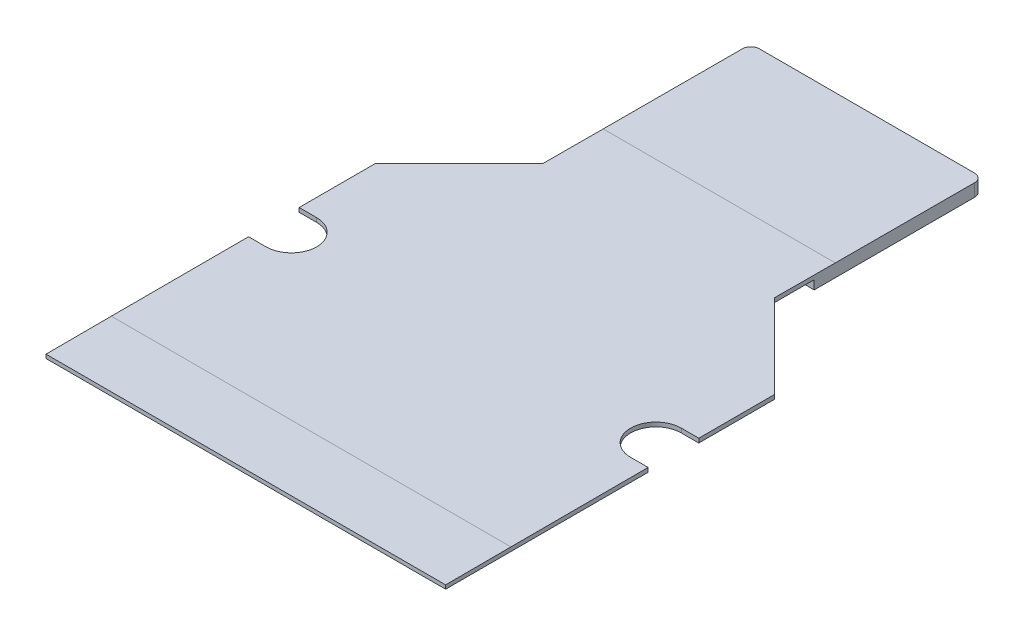
ISO-10303-21;
HEADER;
FILE_DESCRIPTION(('STEP AP214'),'2;1');
FILE_NAME('part.step','',(''),(''),'','','');
FILE_SCHEMA(('AUTOMOTIVE_DESIGN { 1 0 10303 214 1 1 1 1 }'));
ENDSEC;
DATA;
#1=APPLICATION_CONTEXT('core data for automotive mechanical design processes');
#2=APPLICATION_PROTOCOL_DEFINITION('international standard','automotive_design',2000,#1);
#3=PRODUCT_CONTEXT('',#1,'mechanical');
#4=PRODUCT('Part','Part','',(#3));
#5=PRODUCT_RELATED_PRODUCT_CATEGORY('part','',(#4));
#6=PRODUCT_DEFINITION_FORMATION('','',#4);
#7=PRODUCT_DEFINITION_CONTEXT('part definition',#1,'design');
#8=PRODUCT_DEFINITION('design','',#6,#7);
#9=PRODUCT_DEFINITION_SHAPE('','',#8);
#10=(LENGTH_UNIT() NAMED_UNIT(*) SI_UNIT(.MILLI.,.METRE.));
#11=(NAMED_UNIT(*) PLANE_ANGLE_UNIT() SI_UNIT($,.RADIAN.));
#12=(NAMED_UNIT(*) SI_UNIT($,.STERADIAN.) SOLID_ANGLE_UNIT());
#13=UNCERTAINTY_MEASURE_WITH_UNIT(LENGTH_MEASURE(1.E-05),#10,'distance_accuracy_value','');
#14=(GEOMETRIC_REPRESENTATION_CONTEXT(3) GLOBAL_UNCERTAINTY_ASSIGNED_CONTEXT((#13)) GLOBAL_UNIT_ASSIGNED_CONTEXT((#10,
#11,#12)) REPRESENTATION_CONTEXT('',''));
#15=CARTESIAN_POINT('',(0.,0.,0.));
#16=DIRECTION('',(0.,0.,1.));
#17=DIRECTION('',(1.,0.,0.));
#18=AXIS2_PLACEMENT_3D('',#15,#16,#17);
#19=CARTESIAN_POINT('',(-3.3,0.09,-5.47));
#20=DIRECTION('',(0.,-1.,0.));
#21=DIRECTION('',(0.,0.,-1.));
#22=AXIS2_PLACEMENT_3D('',#19,#20,#21);
#23=PLANE('',#22);
#24=DIRECTION('',(-1.,0.,0.));
#25=VECTOR('',#24,1.);
#26=CARTESIAN_POINT('',(3.06,0.09,-9.32));
#27=LINE('',#26,#25);
#28=CARTESIAN_POINT('',(-2.55,0.0900000000000086,-9.32));
#29=VERTEX_POINT('',#28);
#30=CARTESIAN_POINT('',(2.55,0.0900000000000172,-9.32));
#31=VERTEX_POINT('',#30);
#32=EDGE_CURVE('E183',#29,#31,#27,.F.);
#33=ORIENTED_EDGE('',*,*,#32,.F.);
#34=CARTESIAN_POINT('',(-2.55,0.0900000000000345,-9.12));
#35=DIRECTION('',(0.,-1.,0.));
#36=DIRECTION('',(-1.,0.,0.));
#37=AXIS2_PLACEMENT_3D('',#34,#35,#36);
#38=CIRCLE('',#37,0.2);
#39=CARTESIAN_POINT('',(-2.75,0.0900000000000138,-9.12));
#40=VERTEX_POINT('',#39);
#41=EDGE_CURVE('E179',#40,#29,#38,.T.);
#42=ORIENTED_EDGE('',*,*,#41,.F.);
#43=CARTESIAN_POINT('',(-2.75,0.1,-5.82));
#44=DIRECTION('',(0.,-0.00303028911716179,-0.999995408663393));
#45=VECTOR('',#44,1.);
#46=LINE('',#43,#45);
#47=CARTESIAN_POINT('',(-2.75,0.095,-5.82));
#48=VERTEX_POINT('',#47);
#49=EDGE_CURVE('E297',#48,#40,#46,.T.);
#50=ORIENTED_EDGE('',*,*,#49,.F.);
#51=CARTESIAN_POINT('',(2.75,0.1,-5.82));
#52=DIRECTION('',(-1.,0.,0.));
#53=VECTOR('',#52,1.);
#54=LINE('',#51,#53);
#55=CARTESIAN_POINT('',(2.75,0.095000000000016,-5.81999999999474));
#56=VERTEX_POINT('',#55);
#57=EDGE_CURVE('E266',#56,#48,#54,.T.);
#58=ORIENTED_EDGE('',*,*,#57,.F.);
#59=CARTESIAN_POINT('',(2.75,0.09,-9.12));
#60=DIRECTION('',(0.,0.00303028911716179,0.999995408663393));
#61=VECTOR('',#60,1.);
#62=LINE('',#59,#61);
#63=CARTESIAN_POINT('',(2.75,0.0900000000000069,-9.12));
#64=VERTEX_POINT('',#63);
#65=EDGE_CURVE('E272',#64,#56,#62,.T.);
#66=ORIENTED_EDGE('',*,*,#65,.F.);
#67=CARTESIAN_POINT('',(2.55,0.0900000000000345,-9.12));
#68=DIRECTION('',(0.,-1.,0.));
#69=DIRECTION('',(0.,0.,-1.));
#70=AXIS2_PLACEMENT_3D('',#67,#68,#69);
#71=CIRCLE('',#70,0.200000000000001);
#72=EDGE_CURVE('E286',#31,#64,#71,.T.);
#73=ORIENTED_EDGE('',*,*,#72,.F.);
#74=EDGE_LOOP('',(#33,#42,#50,#58,#66,#73));
#75=FACE_BOUND('',#74,.T.);
#76=ADVANCED_FACE('F17',(#75),#23,.F.);
#77=CARTESIAN_POINT('',(-2.75,-0.241,-9.5935));
#78=DIRECTION('',(-1.,0.,0.));
#79=DIRECTION('',(0.,0.,1.));
#80=AXIS2_PLACEMENT_3D('',#77,#78,#79);
#81=PLANE('',#80);
#82=DIRECTION('',(0.,1.,0.));
#83=VECTOR('',#82,1.);
#84=CARTESIAN_POINT('',(-2.75,-0.241,-4.385));
#85=LINE('',#84,#83);
#86=CARTESIAN_POINT('',(-2.75,0.,-4.385));
#87=VERTEX_POINT('',#86);
#88=CARTESIAN_POINT('',(-2.75,0.1,-4.385));
#89=VERTEX_POINT('',#88);
#90=EDGE_CURVE('E553',#87,#89,#85,.T.);
#91=ORIENTED_EDGE('',*,*,#90,.T.);
#92=DIRECTION('',(0.,0.,1.));
#93=VECTOR('',#92,1.);
#94=CARTESIAN_POINT('',(-2.75,0.1,-6.7872));
#95=LINE('',#94,#93);
#96=EDGE_CURVE('E263',#48,#89,#95,.T.);
#97=ORIENTED_EDGE('',*,*,#96,.F.);
#98=ORIENTED_EDGE('',*,*,#49,.T.);
#99=DIRECTION('',(0.,-1.,0.));
#100=VECTOR('',#99,1.);
#101=CARTESIAN_POINT('',(-2.75,-999.9,-9.12));
#102=LINE('',#101,#100);
#103=CARTESIAN_POINT('',(-2.75,-0.210000000000033,-9.12));
#104=VERTEX_POINT('',#103);
#105=EDGE_CURVE('E184',#104,#40,#102,.F.);
#106=ORIENTED_EDGE('',*,*,#105,.F.);
#107=DIRECTION('',(0.,0.,-1.));
#108=VECTOR('',#107,1.);
#109=CARTESIAN_POINT('',(-2.75,-0.21,-4.92));
#110=LINE('',#109,#108);
#111=CARTESIAN_POINT('',(-2.75,-0.21,-5.32));
#112=VERTEX_POINT('',#111);
#113=EDGE_CURVE('E165',#112,#104,#110,.T.);
#114=ORIENTED_EDGE('',*,*,#113,.F.);
#115=DIRECTION('',(0.,1.,0.));
#116=VECTOR('',#115,1.);
#117=CARTESIAN_POINT('',(-2.75,-0.241,-5.32));
#118=LINE('',#117,#116);
#119=CARTESIAN_POINT('',(-2.75,0.,-5.32));
#120=VERTEX_POINT('',#119);
#121=EDGE_CURVE('E294',#112,#120,#118,.T.);
#122=ORIENTED_EDGE('',*,*,#121,.T.);
#123=DIRECTION('',(0.,0.,1.));
#124=VECTOR('',#123,1.);
#125=CARTESIAN_POINT('',(-2.75,0.,-9.5935));
#126=LINE('',#125,#124);
#127=EDGE_CURVE('E296',#120,#87,#126,.T.);
#128=ORIENTED_EDGE('',*,*,#127,.T.);
#129=EDGE_LOOP('',(#91,#97,#98,#106,#114,#122,#128));
#130=FACE_BOUND('',#129,.T.);
#131=ADVANCED_FACE('F547',(#130),#81,.T.);
#132=CARTESIAN_POINT('',(-2.55,-999.9,-9.12));
#133=DIRECTION('',(0.,-1.,0.));
#134=DIRECTION('',(0.,0.,-1.));
#135=AXIS2_PLACEMENT_3D('',#132,#133,#134);
#136=CYLINDRICAL_SURFACE('',#135,0.2);
#137=CARTESIAN_POINT('',(-2.55,-0.210000000000043,-9.12));
#138=DIRECTION('',(0.,-1.,0.));
#139=DIRECTION('',(0.,0.,-1.));
#140=AXIS2_PLACEMENT_3D('',#137,#138,#139);
#141=CIRCLE('',#140,0.2);
#142=CARTESIAN_POINT('',(-2.55,-0.210000000000022,-9.32));
#143=VERTEX_POINT('',#142);
#144=EDGE_CURVE('E21',#104,#143,#141,.T.);
#145=ORIENTED_EDGE('',*,*,#144,.F.);
#146=ORIENTED_EDGE('',*,*,#105,.T.);
#147=ORIENTED_EDGE('',*,*,#41,.T.);
#148=DIRECTION('',(0.,1.,0.));
#149=VECTOR('',#148,1.);
#150=CARTESIAN_POINT('',(-2.55,-0.24,-9.32));
#151=LINE('',#150,#149);
#152=EDGE_CURVE('E176',#143,#29,#151,.T.);
#153=ORIENTED_EDGE('',*,*,#152,.F.);
#154=EDGE_LOOP('',(#145,#146,#147,#153));
#155=FACE_BOUND('',#154,.T.);
#156=ADVANCED_FACE('F177',(#155),#136,.T.);
#157=CARTESIAN_POINT('',(3.06,-0.24,-9.32));
#158=DIRECTION('',(0.,0.,-1.));
#159=DIRECTION('',(-1.,0.,0.));
#160=AXIS2_PLACEMENT_3D('',#157,#158,#159);
#161=PLANE('',#160);
#162=DIRECTION('',(0.,-1.,0.));
#163=VECTOR('',#162,1.);
#164=CARTESIAN_POINT('',(2.55,-999.9,-9.32));
#165=LINE('',#164,#163);
#166=CARTESIAN_POINT('',(2.55,-0.210000000000033,-9.32));
#167=VERTEX_POINT('',#166);
#168=EDGE_CURVE('E188',#167,#31,#165,.F.);
#169=ORIENTED_EDGE('',*,*,#168,.F.);
#170=DIRECTION('',(1.,0.,0.));
#171=VECTOR('',#170,1.);
#172=CARTESIAN_POINT('',(-3.3,-0.21,-9.32));
#173=LINE('',#172,#171);
#174=EDGE_CURVE('E171',#143,#167,#173,.T.);
#175=ORIENTED_EDGE('',*,*,#174,.F.);
#176=ORIENTED_EDGE('',*,*,#152,.T.);
#177=ORIENTED_EDGE('',*,*,#32,.T.);
#178=EDGE_LOOP('',(#169,#175,#176,#177));
#179=FACE_BOUND('',#178,.T.);
#180=ADVANCED_FACE('F186',(#179),#161,.T.);
#181=CARTESIAN_POINT('',(2.55,-999.9,-9.12));
#182=DIRECTION('',(0.,-1.,0.));
#183=DIRECTION('',(0.,0.,-1.));
#184=AXIS2_PLACEMENT_3D('',#181,#182,#183);
#185=CYLINDRICAL_SURFACE('',#184,0.2);
#186=CARTESIAN_POINT('',(2.55,-0.210000000000043,-9.12));
#187=DIRECTION('',(0.,-1.,0.));
#188=DIRECTION('',(0.,0.,-1.));
#189=AXIS2_PLACEMENT_3D('',#186,#187,#188);
#190=CIRCLE('',#189,0.2);
#191=CARTESIAN_POINT('',(2.75,-0.210000000000022,-9.12));
#192=VERTEX_POINT('',#191);
#193=EDGE_CURVE('E190',#167,#192,#190,.T.);
#194=ORIENTED_EDGE('',*,*,#193,.F.);
#195=ORIENTED_EDGE('',*,*,#168,.T.);
#196=ORIENTED_EDGE('',*,*,#72,.T.);
#197=DIRECTION('',(0.,1.,0.));
#198=VECTOR('',#197,1.);
#199=CARTESIAN_POINT('',(2.75,-0.241,-9.12));
#200=LINE('',#199,#198);
#201=EDGE_CURVE('E269',#192,#64,#200,.T.);
#202=ORIENTED_EDGE('',*,*,#201,.F.);
#203=EDGE_LOOP('',(#194,#195,#196,#202));
#204=FACE_BOUND('',#203,.T.);
#205=ADVANCED_FACE('F586',(#204),#185,.T.);
#206=CARTESIAN_POINT('',(2.75,-0.241,-3.9115));
#207=DIRECTION('',(1.,0.,0.));
#208=DIRECTION('',(0.,0.,-1.));
#209=AXIS2_PLACEMENT_3D('',#206,#207,#208);
#210=PLANE('',#209);
#211=ORIENTED_EDGE('',*,*,#201,.T.);
#212=ORIENTED_EDGE('',*,*,#65,.T.);
#213=DIRECTION('',(0.,0.,1.));
#214=VECTOR('',#213,1.);
#215=CARTESIAN_POINT('',(2.75,0.1,-6.7872));
#216=LINE('',#215,#214);
#217=CARTESIAN_POINT('',(2.75,0.1,-4.385));
#218=VERTEX_POINT('',#217);
#219=EDGE_CURVE('E331',#218,#56,#216,.F.);
#220=ORIENTED_EDGE('',*,*,#219,.F.);
#221=DIRECTION('',(0.,1.,0.));
#222=VECTOR('',#221,1.);
#223=CARTESIAN_POINT('',(2.75,-0.241,-4.385));
#224=LINE('',#223,#222);
#225=CARTESIAN_POINT('',(2.75,0.,-4.385));
#226=VERTEX_POINT('',#225);
#227=EDGE_CURVE('E285',#218,#226,#224,.F.);
#228=ORIENTED_EDGE('',*,*,#227,.T.);
#229=DIRECTION('',(0.,0.,-1.));
#230=VECTOR('',#229,1.);
#231=CARTESIAN_POINT('',(2.75,0.,-3.9115));
#232=LINE('',#231,#230);
#233=CARTESIAN_POINT('',(2.75,0.,-5.32));
#234=VERTEX_POINT('',#233);
#235=EDGE_CURVE('E277',#226,#234,#232,.T.);
#236=ORIENTED_EDGE('',*,*,#235,.T.);
#237=DIRECTION('',(0.,1.,0.));
#238=VECTOR('',#237,1.);
#239=CARTESIAN_POINT('',(2.75,-0.241,-5.32));
#240=LINE('',#239,#238);
#241=CARTESIAN_POINT('',(2.75,-0.21,-5.32));
#242=VERTEX_POINT('',#241);
#243=EDGE_CURVE('E273',#234,#242,#240,.F.);
#244=ORIENTED_EDGE('',*,*,#243,.T.);
#245=DIRECTION('',(0.,0.,-1.));
#246=VECTOR('',#245,1.);
#247=CARTESIAN_POINT('',(2.75,-0.21,-4.92));
#248=LINE('',#247,#246);
#249=EDGE_CURVE('E192',#192,#242,#248,.F.);
#250=ORIENTED_EDGE('',*,*,#249,.F.);
#251=EDGE_LOOP('',(#211,#212,#220,#228,#236,#244,#250));
#252=FACE_BOUND('',#251,.T.);
#253=ADVANCED_FACE('F595',(#252),#210,.T.);
#254=CARTESIAN_POINT('',(-5.682,0.09,5.5548));
#255=DIRECTION('',(0.,-1.,0.));
#256=DIRECTION('',(0.,0.,-1.));
#257=AXIS2_PLACEMENT_3D('',#254,#255,#256);
#258=PLANE('',#257);
#259=CARTESIAN_POINT('',(4.735,0.09,3.852));
#260=DIRECTION('',(0.,0.,1.));
#261=VECTOR('',#260,1.);
#262=LINE('',#259,#261);
#263=CARTESIAN_POINT('',(4.735,0.095,3.852));
#264=VERTEX_POINT('',#263);
#265=CARTESIAN_POINT('',(4.735,0.09,5.4));
#266=VERTEX_POINT('',#265);
#267=EDGE_CURVE('E339',#264,#266,#262,.T.);
#268=ORIENTED_EDGE('',*,*,#267,.F.);
#269=CARTESIAN_POINT('',(-4.735,0.1,3.852));
#270=DIRECTION('',(1.,0.,0.));
#271=VECTOR('',#270,1.);
#272=LINE('',#269,#271);
#273=CARTESIAN_POINT('',(-4.735,0.0949999999999992,3.85200000000026));
#274=VERTEX_POINT('',#273);
#275=EDGE_CURVE('E198',#274,#264,#272,.T.);
#276=ORIENTED_EDGE('',*,*,#275,.F.);
#277=DIRECTION('',(0.,0.,-1.));
#278=VECTOR('',#277,1.);
#279=CARTESIAN_POINT('',(-4.735,0.09,5.5548));
#280=LINE('',#279,#278);
#281=CARTESIAN_POINT('',(-4.735,0.09,5.4));
#282=VERTEX_POINT('',#281);
#283=EDGE_CURVE('E234',#282,#274,#280,.T.);
#284=ORIENTED_EDGE('',*,*,#283,.F.);
#285=DIRECTION('',(1.,0.,0.));
#286=VECTOR('',#285,1.);
#287=CARTESIAN_POINT('',(-5.682,0.09,5.4));
#288=LINE('',#287,#286);
#289=EDGE_CURVE('E231',#266,#282,#288,.F.);
#290=ORIENTED_EDGE('',*,*,#289,.F.);
#291=EDGE_LOOP('',(#268,#276,#284,#290));
#292=FACE_BOUND('',#291,.T.);
#293=ADVANCED_FACE('F320',(#292),#258,.F.);
#294=CARTESIAN_POINT('',(-5.682,0.1,-6.7872));
#295=DIRECTION('',(0.,1.,0.));
#296=DIRECTION('',(0.,0.,1.));
#297=AXIS2_PLACEMENT_3D('',#294,#295,#296);
#298=PLANE('',#297);
#299=DIRECTION('',(0.,0.,-1.));
#300=VECTOR('',#299,1.);
#301=CARTESIAN_POINT('',(4.735,0.1,-0.42));
#302=LINE('',#301,#300);
#303=CARTESIAN_POINT('',(4.735,0.1,-2.4));
#304=VERTEX_POINT('',#303);
#305=CARTESIAN_POINT('',(4.735,0.1,-0.6));
#306=VERTEX_POINT('',#305);
#307=EDGE_CURVE('E207',#304,#306,#302,.F.);
#308=ORIENTED_EDGE('',*,*,#307,.F.);
#309=DIRECTION('',(-0.707106781186548,0.,-0.707106781186548));
#310=VECTOR('',#309,1.);
#311=CARTESIAN_POINT('',(4.9335,0.1,-2.2015));
#312=LINE('',#311,#310);
#313=EDGE_CURVE('E212',#218,#304,#312,.F.);
#314=ORIENTED_EDGE('',*,*,#313,.F.);
#315=ORIENTED_EDGE('',*,*,#219,.T.);
#316=ORIENTED_EDGE('',*,*,#57,.T.);
#317=ORIENTED_EDGE('',*,*,#96,.T.);
#318=DIRECTION('',(-0.707106781186548,0.,0.707106781186548));
#319=VECTOR('',#318,1.);
#320=CARTESIAN_POINT('',(-2.5515,0.1,-4.5835));
#321=LINE('',#320,#319);
#322=CARTESIAN_POINT('',(-4.735,0.1,-2.4));
#323=VERTEX_POINT('',#322);
#324=EDGE_CURVE('E256',#323,#89,#321,.F.);
#325=ORIENTED_EDGE('',*,*,#324,.F.);
#326=DIRECTION('',(0.,0.,1.));
#327=VECTOR('',#326,1.);
#328=CARTESIAN_POINT('',(-4.735,0.1,-2.58));
#329=LINE('',#328,#327);
#330=CARTESIAN_POINT('',(-4.735,0.1,-0.6));
#331=VERTEX_POINT('',#330);
#332=EDGE_CURVE('E254',#331,#323,#329,.F.);
#333=ORIENTED_EDGE('',*,*,#332,.F.);
#334=DIRECTION('',(1.,0.,0.));
#335=VECTOR('',#334,1.);
#336=CARTESIAN_POINT('',(-4.7765,0.1,-0.6));
#337=LINE('',#336,#335);
#338=CARTESIAN_POINT('',(-4.32,0.0999999999999917,-0.6));
#339=VERTEX_POINT('',#338);
#340=EDGE_CURVE('E248',#339,#331,#337,.F.);
#341=ORIENTED_EDGE('',*,*,#340,.F.);
#342=CARTESIAN_POINT('',(-4.32,0.099999999999989,0.));
#343=DIRECTION('',(0.,-1.,0.));
#344=DIRECTION('',(0.,0.,-1.));
#345=AXIS2_PLACEMENT_3D('',#342,#343,#344);
#346=CIRCLE('',#345,0.6);
#347=CARTESIAN_POINT('',(-4.32,0.0999999999999945,0.6));
#348=VERTEX_POINT('',#347);
#349=EDGE_CURVE('E245',#339,#348,#346,.T.);
#350=ORIENTED_EDGE('',*,*,#349,.T.);
#351=DIRECTION('',(-1.,0.,0.));
#352=VECTOR('',#351,1.);
#353=CARTESIAN_POINT('',(-4.2785,0.1,0.6));
#354=LINE('',#353,#352);
#355=CARTESIAN_POINT('',(-4.735,0.1,0.6));
#356=VERTEX_POINT('',#355);
#357=EDGE_CURVE('E243',#356,#348,#354,.F.);
#358=ORIENTED_EDGE('',*,*,#357,.F.);
#359=DIRECTION('',(0.,0.,1.));
#360=VECTOR('',#359,1.);
#361=CARTESIAN_POINT('',(-4.735,0.1,0.12));
#362=LINE('',#361,#360);
#363=EDGE_CURVE('E237',#274,#356,#362,.F.);
#364=ORIENTED_EDGE('',*,*,#363,.F.);
#365=ORIENTED_EDGE('',*,*,#275,.T.);
#366=DIRECTION('',(0.,0.,-1.));
#367=VECTOR('',#366,1.);
#368=CARTESIAN_POINT('',(4.735,0.1,5.88));
#369=LINE('',#368,#367);
#370=CARTESIAN_POINT('',(4.735,0.1,0.6));
#371=VERTEX_POINT('',#370);
#372=EDGE_CURVE('E223',#371,#264,#369,.F.);
#373=ORIENTED_EDGE('',*,*,#372,.F.);
#374=DIRECTION('',(-1.,0.,0.));
#375=VECTOR('',#374,1.);
#376=CARTESIAN_POINT('',(4.7765,0.1,0.6));
#377=LINE('',#376,#375);
#378=CARTESIAN_POINT('',(4.32,0.0999999999999917,0.6));
#379=VERTEX_POINT('',#378);
#380=EDGE_CURVE('E220',#379,#371,#377,.F.);
#381=ORIENTED_EDGE('',*,*,#380,.F.);
#382=CARTESIAN_POINT('',(4.32,0.099999999999989,0.));
#383=DIRECTION('',(0.,-1.,0.));
#384=DIRECTION('',(0.,0.,-1.));
#385=AXIS2_PLACEMENT_3D('',#382,#383,#384);
#386=CIRCLE('',#385,0.6);
#387=CARTESIAN_POINT('',(4.32,0.0999999999999945,-0.6));
#388=VERTEX_POINT('',#387);
#389=EDGE_CURVE('E204',#379,#388,#386,.T.);
#390=ORIENTED_EDGE('',*,*,#389,.T.);
#391=DIRECTION('',(1.,0.,0.));
#392=VECTOR('',#391,1.);
#393=CARTESIAN_POINT('',(4.2785,0.1,-0.6));
#394=LINE('',#393,#392);
#395=EDGE_CURVE('E201',#306,#388,#394,.F.);
#396=ORIENTED_EDGE('',*,*,#395,.F.);
#397=EDGE_LOOP('',(#308,#314,#315,#316,#317,#325,#333,#341,#350,#358,#364,#365,#373,#381,#390,#396));
#398=FACE_BOUND('',#397,.T.);
#399=ADVANCED_FACE('F310',(#398),#298,.T.);
#400=CARTESIAN_POINT('',(-3.3,-0.21,-4.92));
#401=DIRECTION('',(0.,-1.,0.));
#402=DIRECTION('',(0.,0.,-1.));
#403=AXIS2_PLACEMENT_3D('',#400,#401,#402);
#404=PLANE('',#403);
#405=ORIENTED_EDGE('',*,*,#193,.T.);
#406=ORIENTED_EDGE('',*,*,#249,.T.);
#407=DIRECTION('',(-1.,0.,0.));
#408=VECTOR('',#407,1.);
#409=CARTESIAN_POINT('',(3.3,-0.21,-5.32));
#410=LINE('',#409,#408);
#411=EDGE_CURVE('E217',#242,#112,#410,.T.);
#412=ORIENTED_EDGE('',*,*,#411,.T.);
#413=ORIENTED_EDGE('',*,*,#113,.T.);
#414=ORIENTED_EDGE('',*,*,#144,.T.);
#415=ORIENTED_EDGE('',*,*,#174,.T.);
#416=EDGE_LOOP('',(#405,#406,#412,#413,#414,#415));
#417=FACE_BOUND('',#416,.T.);
#418=ADVANCED_FACE('F169',(#417),#404,.T.);
#419=CARTESIAN_POINT('',(-2.5515,-0.01,-4.5835));
#420=DIRECTION('',(-0.707106781186548,0.,-0.707106781186548));
#421=DIRECTION('',(-0.707106781186548,0.,0.707106781186548));
#422=AXIS2_PLACEMENT_3D('',#419,#420,#421);
#423=PLANE('',#422);
#424=DIRECTION('',(-0.707106781186548,0.,0.707106781186548));
#425=VECTOR('',#424,1.);
#426=CARTESIAN_POINT('',(-2.75,0.,-4.385));
#427=LINE('',#426,#425);
#428=CARTESIAN_POINT('',(-4.735,0.,-2.4));
#429=VERTEX_POINT('',#428);
#430=EDGE_CURVE('E281',#87,#429,#427,.T.);
#431=ORIENTED_EDGE('',*,*,#430,.T.);
#432=DIRECTION('',(0.,1.,0.));
#433=VECTOR('',#432,1.);
#434=CARTESIAN_POINT('',(-4.735,-0.01,-2.4));
#435=LINE('',#434,#433);
#436=EDGE_CURVE('E251',#323,#429,#435,.F.);
#437=ORIENTED_EDGE('',*,*,#436,.F.);
#438=ORIENTED_EDGE('',*,*,#324,.T.);
#439=ORIENTED_EDGE('',*,*,#90,.F.);
#440=EDGE_LOOP('',(#431,#437,#438,#439));
#441=FACE_BOUND('',#440,.T.);
#442=ADVANCED_FACE('F410',(#441),#423,.T.);
#443=CARTESIAN_POINT('',(-4.735,-0.01,-2.58));
#444=DIRECTION('',(-1.,0.,0.));
#445=DIRECTION('',(0.,0.,1.));
#446=AXIS2_PLACEMENT_3D('',#443,#444,#445);
#447=PLANE('',#446);
#448=DIRECTION('',(0.,0.,1.));
#449=VECTOR('',#448,1.);
#450=CARTESIAN_POINT('',(-4.735,0.,-6.392));
#451=LINE('',#450,#449);
#452=CARTESIAN_POINT('',(-4.735,0.,-0.6));
#453=VERTEX_POINT('',#452);
#454=EDGE_CURVE('E488',#429,#453,#451,.T.);
#455=ORIENTED_EDGE('',*,*,#454,.T.);
#456=DIRECTION('',(0.,1.,0.));
#457=VECTOR('',#456,1.);
#458=CARTESIAN_POINT('',(-4.735,-0.01,-0.6));
#459=LINE('',#458,#457);
#460=EDGE_CURVE('E250',#331,#453,#459,.F.);
#461=ORIENTED_EDGE('',*,*,#460,.F.);
#462=ORIENTED_EDGE('',*,*,#332,.T.);
#463=ORIENTED_EDGE('',*,*,#436,.T.);
#464=EDGE_LOOP('',(#455,#461,#462,#463));
#465=FACE_BOUND('',#464,.T.);
#466=ADVANCED_FACE('F407',(#465),#447,.T.);
#467=CARTESIAN_POINT('',(-4.7765,-0.01,-0.6));
#468=DIRECTION('',(0.,0.,1.));
#469=DIRECTION('',(1.,0.,0.));
#470=AXIS2_PLACEMENT_3D('',#467,#468,#469);
#471=PLANE('',#470);
#472=DIRECTION('',(1.,0.,0.));
#473=VECTOR('',#472,1.);
#474=CARTESIAN_POINT('',(-5.682,0.,-0.6));
#475=LINE('',#474,#473);
#476=CARTESIAN_POINT('',(-4.32,0.,-0.6));
#477=VERTEX_POINT('',#476);
#478=EDGE_CURVE('E485',#453,#477,#475,.T.);
#479=ORIENTED_EDGE('',*,*,#478,.T.);
#480=DIRECTION('',(0.,-1.,0.));
#481=VECTOR('',#480,1.);
#482=CARTESIAN_POINT('',(-4.32,-999.9,-0.6));
#483=LINE('',#482,#481);
#484=EDGE_CURVE('E523',#477,#339,#483,.F.);
#485=ORIENTED_EDGE('',*,*,#484,.T.);
#486=ORIENTED_EDGE('',*,*,#340,.T.);
#487=ORIENTED_EDGE('',*,*,#460,.T.);
#488=EDGE_LOOP('',(#479,#485,#486,#487));
#489=FACE_BOUND('',#488,.T.);
#490=ADVANCED_FACE('F403',(#489),#471,.T.);
#491=CARTESIAN_POINT('',(-4.32,-999.9,0.));
#492=DIRECTION('',(0.,-1.,0.));
#493=DIRECTION('',(0.,0.,-1.));
#494=AXIS2_PLACEMENT_3D('',#491,#492,#493);
#495=CYLINDRICAL_SURFACE('',#494,0.6);
#496=ORIENTED_EDGE('',*,*,#484,.F.);
#497=CARTESIAN_POINT('',(-4.32,0.,0.));
#498=DIRECTION('',(0.,-1.,0.));
#499=DIRECTION('',(0.,0.,-1.));
#500=AXIS2_PLACEMENT_3D('',#497,#498,#499);
#501=CIRCLE('',#500,0.6);
#502=CARTESIAN_POINT('',(-4.32,0.,0.6));
#503=VERTEX_POINT('',#502);
#504=EDGE_CURVE('E482',#477,#503,#501,.T.);
#505=ORIENTED_EDGE('',*,*,#504,.T.);
#506=DIRECTION('',(0.,1.,0.));
#507=VECTOR('',#506,1.);
#508=CARTESIAN_POINT('',(-4.32,-0.01,0.6));
#509=LINE('',#508,#507);
#510=EDGE_CURVE('E240',#348,#503,#509,.F.);
#511=ORIENTED_EDGE('',*,*,#510,.F.);
#512=ORIENTED_EDGE('',*,*,#349,.F.);
#513=EDGE_LOOP('',(#496,#505,#511,#512));
#514=FACE_BOUND('',#513,.T.);
#515=ADVANCED_FACE('F399',(#514),#495,.F.);
#516=CARTESIAN_POINT('',(-4.2785,-0.01,0.6));
#517=DIRECTION('',(0.,0.,-1.));
#518=DIRECTION('',(-1.,0.,0.));
#519=AXIS2_PLACEMENT_3D('',#516,#517,#518);
#520=PLANE('',#519);
#521=DIRECTION('',(1.,0.,0.));
#522=VECTOR('',#521,1.);
#523=CARTESIAN_POINT('',(-5.682,0.,0.6));
#524=LINE('',#523,#522);
#525=CARTESIAN_POINT('',(-4.735,0.,0.6));
#526=VERTEX_POINT('',#525);
#527=EDGE_CURVE('E478',#503,#526,#524,.F.);
#528=ORIENTED_EDGE('',*,*,#527,.T.);
#529=DIRECTION('',(0.,1.,0.));
#530=VECTOR('',#529,1.);
#531=CARTESIAN_POINT('',(-4.735,-0.01,0.6));
#532=LINE('',#531,#530);
#533=EDGE_CURVE('E239',#356,#526,#532,.F.);
#534=ORIENTED_EDGE('',*,*,#533,.F.);
#535=ORIENTED_EDGE('',*,*,#357,.T.);
#536=ORIENTED_EDGE('',*,*,#510,.T.);
#537=EDGE_LOOP('',(#528,#534,#535,#536));
#538=FACE_BOUND('',#537,.T.);
#539=ADVANCED_FACE('F395',(#538),#520,.T.);
#540=CARTESIAN_POINT('',(-4.735,-0.01,0.12));
#541=DIRECTION('',(-1.,0.,0.));
#542=DIRECTION('',(0.,0.,1.));
#543=AXIS2_PLACEMENT_3D('',#540,#541,#542);
#544=PLANE('',#543);
#545=DIRECTION('',(0.,1.,0.));
#546=VECTOR('',#545,1.);
#547=CARTESIAN_POINT('',(-4.735,-0.009,5.4));
#548=LINE('',#547,#546);
#549=CARTESIAN_POINT('',(-4.735,0.,5.4));
#550=VERTEX_POINT('',#549);
#551=EDGE_CURVE('E233',#282,#550,#548,.F.);
#552=ORIENTED_EDGE('',*,*,#551,.F.);
#553=ORIENTED_EDGE('',*,*,#283,.T.);
#554=ORIENTED_EDGE('',*,*,#363,.T.);
#555=ORIENTED_EDGE('',*,*,#533,.T.);
#556=DIRECTION('',(0.,0.,1.));
#557=VECTOR('',#556,1.);
#558=CARTESIAN_POINT('',(-4.735,0.,-6.392));
#559=LINE('',#558,#557);
#560=EDGE_CURVE('E481',#526,#550,#559,.T.);
#561=ORIENTED_EDGE('',*,*,#560,.T.);
#562=EDGE_LOOP('',(#552,#553,#554,#555,#561));
#563=FACE_BOUND('',#562,.T.);
#564=ADVANCED_FACE('F391',(#563),#544,.T.);
#565=CARTESIAN_POINT('',(-5.682,-0.009,5.4));
#566=DIRECTION('',(0.,0.,1.));
#567=DIRECTION('',(1.,0.,0.));
#568=AXIS2_PLACEMENT_3D('',#565,#566,#567);
#569=PLANE('',#568);
#570=ORIENTED_EDGE('',*,*,#551,.T.);
#571=DIRECTION('',(1.,0.,0.));
#572=VECTOR('',#571,1.);
#573=CARTESIAN_POINT('',(-5.682,0.,5.4));
#574=LINE('',#573,#572);
#575=CARTESIAN_POINT('',(4.735,0.,5.4));
#576=VERTEX_POINT('',#575);
#577=EDGE_CURVE('E470',#550,#576,#574,.T.);
#578=ORIENTED_EDGE('',*,*,#577,.T.);
#579=DIRECTION('',(0.,1.,0.));
#580=VECTOR('',#579,1.);
#581=CARTESIAN_POINT('',(4.735,-0.01,5.4));
#582=LINE('',#581,#580);
#583=EDGE_CURVE('E228',#266,#576,#582,.F.);
#584=ORIENTED_EDGE('',*,*,#583,.F.);
#585=ORIENTED_EDGE('',*,*,#289,.T.);
#586=EDGE_LOOP('',(#570,#578,#584,#585));
#587=FACE_BOUND('',#586,.T.);
#588=ADVANCED_FACE('F387',(#587),#569,.T.);
#589=CARTESIAN_POINT('',(4.735,-0.01,5.88));
#590=DIRECTION('',(1.,0.,0.));
#591=DIRECTION('',(0.,0.,-1.));
#592=AXIS2_PLACEMENT_3D('',#589,#590,#591);
#593=PLANE('',#592);
#594=DIRECTION('',(0.,1.,0.));
#595=VECTOR('',#594,1.);
#596=CARTESIAN_POINT('',(4.735,-0.01,0.6));
#597=LINE('',#596,#595);
#598=CARTESIAN_POINT('',(4.735,0.,0.6));
#599=VERTEX_POINT('',#598);
#600=EDGE_CURVE('E222',#371,#599,#597,.F.);
#601=ORIENTED_EDGE('',*,*,#600,.F.);
#602=ORIENTED_EDGE('',*,*,#372,.T.);
#603=ORIENTED_EDGE('',*,*,#267,.T.);
#604=ORIENTED_EDGE('',*,*,#583,.T.);
#605=DIRECTION('',(0.,0.,1.));
#606=VECTOR('',#605,1.);
#607=CARTESIAN_POINT('',(4.735,0.,-6.392));
#608=LINE('',#607,#606);
#609=EDGE_CURVE('E468',#576,#599,#608,.F.);
#610=ORIENTED_EDGE('',*,*,#609,.T.);
#611=EDGE_LOOP('',(#601,#602,#603,#604,#610));
#612=FACE_BOUND('',#611,.T.);
#613=ADVANCED_FACE('F376',(#612),#593,.T.);
#614=CARTESIAN_POINT('',(4.7765,-0.01,0.6));
#615=DIRECTION('',(0.,0.,-1.));
#616=DIRECTION('',(-1.,0.,0.));
#617=AXIS2_PLACEMENT_3D('',#614,#615,#616);
#618=PLANE('',#617);
#619=DIRECTION('',(1.,0.,0.));
#620=VECTOR('',#619,1.);
#621=CARTESIAN_POINT('',(-5.682,0.,0.6));
#622=LINE('',#621,#620);
#623=CARTESIAN_POINT('',(4.32,0.,0.6));
#624=VERTEX_POINT('',#623);
#625=EDGE_CURVE('E461',#599,#624,#622,.F.);
#626=ORIENTED_EDGE('',*,*,#625,.T.);
#627=DIRECTION('',(0.,-1.,0.));
#628=VECTOR('',#627,1.);
#629=CARTESIAN_POINT('',(4.32,-999.9,0.6));
#630=LINE('',#629,#628);
#631=EDGE_CURVE('E451',#624,#379,#630,.F.);
#632=ORIENTED_EDGE('',*,*,#631,.T.);
#633=ORIENTED_EDGE('',*,*,#380,.T.);
#634=ORIENTED_EDGE('',*,*,#600,.T.);
#635=EDGE_LOOP('',(#626,#632,#633,#634));
#636=FACE_BOUND('',#635,.T.);
#637=ADVANCED_FACE('F386',(#636),#618,.T.);
#638=CARTESIAN_POINT('',(4.32,-999.9,0.));
#639=DIRECTION('',(0.,-1.,0.));
#640=DIRECTION('',(0.,0.,-1.));
#641=AXIS2_PLACEMENT_3D('',#638,#639,#640);
#642=CYLINDRICAL_SURFACE('',#641,0.6);
#643=ORIENTED_EDGE('',*,*,#631,.F.);
#644=CARTESIAN_POINT('',(4.32,0.,0.));
#645=DIRECTION('',(0.,-1.,0.));
#646=DIRECTION('',(0.,0.,-1.));
#647=AXIS2_PLACEMENT_3D('',#644,#645,#646);
#648=CIRCLE('',#647,0.6);
#649=CARTESIAN_POINT('',(4.32,0.,-0.6));
#650=VERTEX_POINT('',#649);
#651=EDGE_CURVE('E454',#624,#650,#648,.T.);
#652=ORIENTED_EDGE('',*,*,#651,.T.);
#653=DIRECTION('',(0.,1.,0.));
#654=VECTOR('',#653,1.);
#655=CARTESIAN_POINT('',(4.32,-0.01,-0.6));
#656=LINE('',#655,#654);
#657=EDGE_CURVE('E203',#388,#650,#656,.F.);
#658=ORIENTED_EDGE('',*,*,#657,.F.);
#659=ORIENTED_EDGE('',*,*,#389,.F.);
#660=EDGE_LOOP('',(#643,#652,#658,#659));
#661=FACE_BOUND('',#660,.T.);
#662=ADVANCED_FACE('F440',(#661),#642,.F.);
#663=CARTESIAN_POINT('',(4.2785,-0.01,-0.6));
#664=DIRECTION('',(0.,0.,1.));
#665=DIRECTION('',(1.,0.,0.));
#666=AXIS2_PLACEMENT_3D('',#663,#664,#665);
#667=PLANE('',#666);
#668=DIRECTION('',(1.,0.,0.));
#669=VECTOR('',#668,1.);
#670=CARTESIAN_POINT('',(-5.682,0.,-0.6));
#671=LINE('',#670,#669);
#672=CARTESIAN_POINT('',(4.735,0.,-0.6));
#673=VERTEX_POINT('',#672);
#674=EDGE_CURVE('E465',#650,#673,#671,.T.);
#675=ORIENTED_EDGE('',*,*,#674,.T.);
#676=DIRECTION('',(0.,1.,0.));
#677=VECTOR('',#676,1.);
#678=CARTESIAN_POINT('',(4.735,-0.01,-0.6));
#679=LINE('',#678,#677);
#680=EDGE_CURVE('E209',#306,#673,#679,.F.);
#681=ORIENTED_EDGE('',*,*,#680,.F.);
#682=ORIENTED_EDGE('',*,*,#395,.T.);
#683=ORIENTED_EDGE('',*,*,#657,.T.);
#684=EDGE_LOOP('',(#675,#681,#682,#683));
#685=FACE_BOUND('',#684,.T.);
#686=ADVANCED_FACE('F437',(#685),#667,.T.);
#687=CARTESIAN_POINT('',(4.735,-0.01,-0.42));
#688=DIRECTION('',(1.,0.,0.));
#689=DIRECTION('',(0.,0.,-1.));
#690=AXIS2_PLACEMENT_3D('',#687,#688,#689);
#691=PLANE('',#690);
#692=DIRECTION('',(0.,0.,1.));
#693=VECTOR('',#692,1.);
#694=CARTESIAN_POINT('',(4.735,0.,-6.392));
#695=LINE('',#694,#693);
#696=CARTESIAN_POINT('',(4.735,0.,-2.4));
#697=VERTEX_POINT('',#696);
#698=EDGE_CURVE('E492',#673,#697,#695,.F.);
#699=ORIENTED_EDGE('',*,*,#698,.T.);
#700=DIRECTION('',(0.,1.,0.));
#701=VECTOR('',#700,1.);
#702=CARTESIAN_POINT('',(4.735,-0.01,-2.4));
#703=LINE('',#702,#701);
#704=EDGE_CURVE('E36',#304,#697,#703,.F.);
#705=ORIENTED_EDGE('',*,*,#704,.F.);
#706=ORIENTED_EDGE('',*,*,#307,.T.);
#707=ORIENTED_EDGE('',*,*,#680,.T.);
#708=EDGE_LOOP('',(#699,#705,#706,#707));
#709=FACE_BOUND('',#708,.T.);
#710=ADVANCED_FACE('F434',(#709),#691,.T.);
#711=CARTESIAN_POINT('',(4.9335,-0.01,-2.2015));
#712=DIRECTION('',(0.707106781186548,0.,-0.707106781186548));
#713=DIRECTION('',(-0.707106781186548,0.,-0.707106781186548));
#714=AXIS2_PLACEMENT_3D('',#711,#712,#713);
#715=PLANE('',#714);
#716=DIRECTION('',(-0.707106781186548,0.,-0.707106781186548));
#717=VECTOR('',#716,1.);
#718=CARTESIAN_POINT('',(4.735,0.,-2.4));
#719=LINE('',#718,#717);
#720=EDGE_CURVE('E27',#697,#226,#719,.T.);
#721=ORIENTED_EDGE('',*,*,#720,.T.);
#722=ORIENTED_EDGE('',*,*,#227,.F.);
#723=ORIENTED_EDGE('',*,*,#313,.T.);
#724=ORIENTED_EDGE('',*,*,#704,.T.);
#725=EDGE_LOOP('',(#721,#722,#723,#724));
#726=FACE_BOUND('',#725,.T.);
#727=ADVANCED_FACE('F427',(#726),#715,.T.);
#728=CARTESIAN_POINT('',(3.3,-0.231,-5.32));
#729=DIRECTION('',(0.,0.,-1.));
#730=DIRECTION('',(-1.,0.,0.));
#731=AXIS2_PLACEMENT_3D('',#728,#729,#730);
#732=PLANE('',#731);
#733=ORIENTED_EDGE('',*,*,#121,.F.);
#734=ORIENTED_EDGE('',*,*,#411,.F.);
#735=ORIENTED_EDGE('',*,*,#243,.F.);
#736=DIRECTION('',(1.,0.,0.));
#737=VECTOR('',#736,1.);
#738=CARTESIAN_POINT('',(-5.682,0.,-5.32));
#739=LINE('',#738,#737);
#740=EDGE_CURVE('E11',#234,#120,#739,.F.);
#741=ORIENTED_EDGE('',*,*,#740,.T.);
#742=EDGE_LOOP('',(#733,#734,#735,#741));
#743=FACE_BOUND('',#742,.T.);
#744=ADVANCED_FACE('F421',(#743),#732,.F.);
#745=CARTESIAN_POINT('',(-5.682,0.,-6.392));
#746=DIRECTION('',(0.,1.,0.));
#747=DIRECTION('',(0.,0.,1.));
#748=AXIS2_PLACEMENT_3D('',#745,#746,#747);
#749=PLANE('',#748);
#750=ORIENTED_EDGE('',*,*,#235,.F.);
#751=ORIENTED_EDGE('',*,*,#720,.F.);
#752=ORIENTED_EDGE('',*,*,#698,.F.);
#753=ORIENTED_EDGE('',*,*,#674,.F.);
#754=ORIENTED_EDGE('',*,*,#651,.F.);
#755=ORIENTED_EDGE('',*,*,#625,.F.);
#756=ORIENTED_EDGE('',*,*,#609,.F.);
#757=ORIENTED_EDGE('',*,*,#577,.F.);
#758=ORIENTED_EDGE('',*,*,#560,.F.);
#759=ORIENTED_EDGE('',*,*,#527,.F.);
#760=ORIENTED_EDGE('',*,*,#504,.F.);
#761=ORIENTED_EDGE('',*,*,#478,.F.);
#762=ORIENTED_EDGE('',*,*,#454,.F.);
#763=ORIENTED_EDGE('',*,*,#430,.F.);
#764=ORIENTED_EDGE('',*,*,#127,.F.);
#765=ORIENTED_EDGE('',*,*,#740,.F.);
#766=EDGE_LOOP('',(#750,#751,#752,#753,#754,#755,#756,#757,#758,#759,#760,#761,#762,#763,#764,#765));
#767=FACE_BOUND('',#766,.T.);
#768=ADVANCED_FACE('F419',(#767),#749,.F.);
#769=CLOSED_SHELL('',(#76,#131,#156,#180,#205,#253,#293,#399,#418,#442,#466,#490,#515,#539,#564,
#588,#613,#637,#662,#686,#710,#727,#744,#768));
#770=MANIFOLD_SOLID_BREP('B1',#769);
#771=ADVANCED_BREP_SHAPE_REPRESENTATION('',(#18,#770),#14);
#772=SHAPE_DEFINITION_REPRESENTATION(#9,#771);
ENDSEC;
END-ISO-10303-21;
